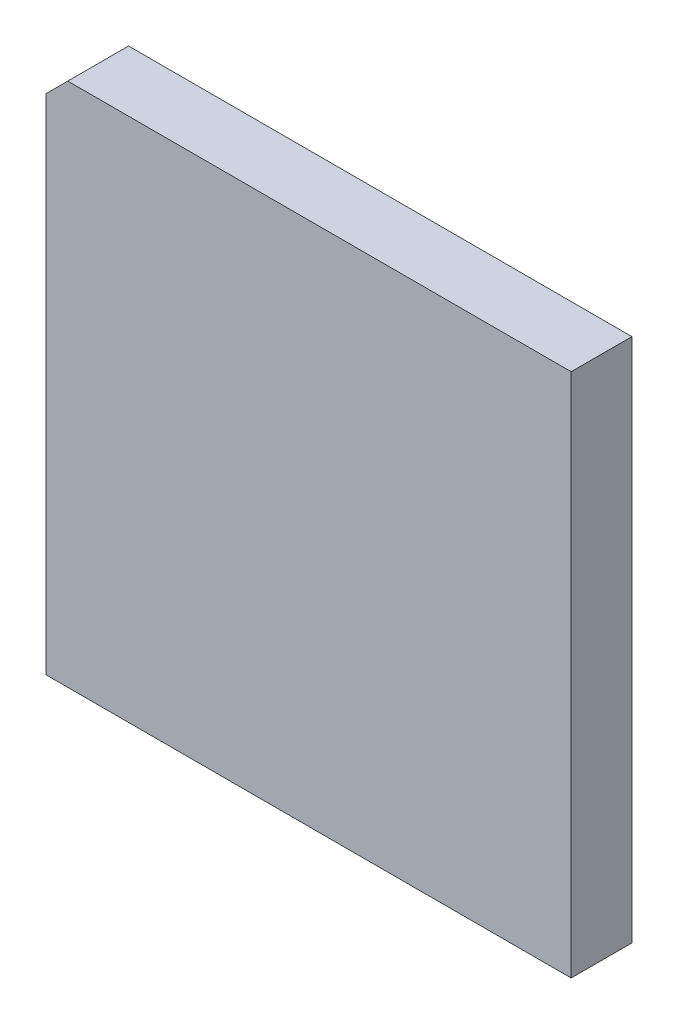
ISO-10303-21;
HEADER;
FILE_DESCRIPTION(('STEP AP214'),'2;1');
FILE_NAME('part.step','',(''),(''),'','','');
FILE_SCHEMA(('AUTOMOTIVE_DESIGN { 1 0 10303 214 1 1 1 1 }'));
ENDSEC;
DATA;
#1=APPLICATION_CONTEXT('core data for automotive mechanical design processes');
#2=APPLICATION_PROTOCOL_DEFINITION('international standard','automotive_design',2000,#1);
#3=PRODUCT_CONTEXT('',#1,'mechanical');
#4=PRODUCT('Part','Part','',(#3));
#5=PRODUCT_RELATED_PRODUCT_CATEGORY('part','',(#4));
#6=PRODUCT_DEFINITION_FORMATION('','',#4);
#7=PRODUCT_DEFINITION_CONTEXT('part definition',#1,'design');
#8=PRODUCT_DEFINITION('design','',#6,#7);
#9=PRODUCT_DEFINITION_SHAPE('','',#8);
#10=(LENGTH_UNIT() NAMED_UNIT(*) SI_UNIT(.MILLI.,.METRE.));
#11=(NAMED_UNIT(*) PLANE_ANGLE_UNIT() SI_UNIT($,.RADIAN.));
#12=(NAMED_UNIT(*) SI_UNIT($,.STERADIAN.) SOLID_ANGLE_UNIT());
#13=UNCERTAINTY_MEASURE_WITH_UNIT(LENGTH_MEASURE(1.E-05),#10,'distance_accuracy_value','');
#14=(GEOMETRIC_REPRESENTATION_CONTEXT(3) GLOBAL_UNCERTAINTY_ASSIGNED_CONTEXT((#13)) GLOBAL_UNIT_ASSIGNED_CONTEXT((#10,
#11,#12)) REPRESENTATION_CONTEXT('',''));
#15=CARTESIAN_POINT('',(0.,0.,0.));
#16=DIRECTION('',(0.,0.,1.));
#17=DIRECTION('',(1.,0.,0.));
#18=AXIS2_PLACEMENT_3D('',#15,#16,#17);
#19=CARTESIAN_POINT('',(6.05,6.05,1.4));
#20=DIRECTION('',(0.,-1.,0.));
#21=DIRECTION('',(0.,0.,-1.));
#22=AXIS2_PLACEMENT_3D('',#19,#20,#21);
#23=PLANE('',#22);
#24=DIRECTION('',(-1.,0.,0.));
#25=VECTOR('',#24,1.);
#26=CARTESIAN_POINT('',(6.05,6.05,0.));
#27=LINE('',#26,#25);
#28=CARTESIAN_POINT('',(6.05,6.05,0.));
#29=VERTEX_POINT('',#28);
#30=CARTESIAN_POINT('',(-5.55,6.05,0.));
#31=VERTEX_POINT('',#30);
#32=EDGE_CURVE('E108',#29,#31,#27,.T.);
#33=ORIENTED_EDGE('',*,*,#32,.T.);
#34=DIRECTION('',(0.,0.,-1.));
#35=VECTOR('',#34,1.);
#36=CARTESIAN_POINT('',(-5.55,6.05,1.4));
#37=LINE('',#36,#35);
#38=CARTESIAN_POINT('',(-5.55,6.05,1.4));
#39=VERTEX_POINT('',#38);
#40=EDGE_CURVE('E11',#39,#31,#37,.T.);
#41=ORIENTED_EDGE('',*,*,#40,.F.);
#42=DIRECTION('',(-1.,0.,0.));
#43=VECTOR('',#42,1.);
#44=CARTESIAN_POINT('',(6.05,6.05,1.4));
#45=LINE('',#44,#43);
#46=CARTESIAN_POINT('',(6.05,6.05,1.4));
#47=VERTEX_POINT('',#46);
#48=EDGE_CURVE('E116',#47,#39,#45,.T.);
#49=ORIENTED_EDGE('',*,*,#48,.F.);
#50=DIRECTION('',(0.,0.,-1.));
#51=VECTOR('',#50,1.);
#52=CARTESIAN_POINT('',(6.05,6.05,1.4));
#53=LINE('',#52,#51);
#54=EDGE_CURVE('E104',#47,#29,#53,.T.);
#55=ORIENTED_EDGE('',*,*,#54,.T.);
#56=EDGE_LOOP('',(#33,#41,#49,#55));
#57=FACE_BOUND('',#56,.T.);
#58=ADVANCED_FACE('F34',(#57),#23,.F.);
#59=CARTESIAN_POINT('',(-5.55,6.05,1.4));
#60=DIRECTION('',(0.707106781186548,-0.707106781186548,0.));
#61=DIRECTION('',(0.707106781186548,0.707106781186548,0.));
#62=AXIS2_PLACEMENT_3D('',#59,#60,#61);
#63=PLANE('',#62);
#64=DIRECTION('',(-0.707106781186548,-0.707106781186548,0.));
#65=VECTOR('',#64,1.);
#66=CARTESIAN_POINT('',(-5.55,6.05,0.));
#67=LINE('',#66,#65);
#68=CARTESIAN_POINT('',(-6.05,5.55,0.));
#69=VERTEX_POINT('',#68);
#70=EDGE_CURVE('E111',#31,#69,#67,.T.);
#71=ORIENTED_EDGE('',*,*,#70,.T.);
#72=DIRECTION('',(0.,0.,-1.));
#73=VECTOR('',#72,1.);
#74=CARTESIAN_POINT('',(-6.05,5.55,1.4));
#75=LINE('',#74,#73);
#76=CARTESIAN_POINT('',(-6.05,5.55,1.4));
#77=VERTEX_POINT('',#76);
#78=EDGE_CURVE('E42',#77,#69,#75,.T.);
#79=ORIENTED_EDGE('',*,*,#78,.F.);
#80=DIRECTION('',(-0.707106781186548,-0.707106781186548,0.));
#81=VECTOR('',#80,1.);
#82=CARTESIAN_POINT('',(-5.55,6.05,1.4));
#83=LINE('',#82,#81);
#84=EDGE_CURVE('E84',#39,#77,#83,.T.);
#85=ORIENTED_EDGE('',*,*,#84,.F.);
#86=ORIENTED_EDGE('',*,*,#40,.T.);
#87=EDGE_LOOP('',(#71,#79,#85,#86));
#88=FACE_BOUND('',#87,.T.);
#89=ADVANCED_FACE('F135',(#88),#63,.F.);
#90=CARTESIAN_POINT('',(-6.05,5.55,1.4));
#91=DIRECTION('',(1.,0.,0.));
#92=DIRECTION('',(0.,0.,-1.));
#93=AXIS2_PLACEMENT_3D('',#90,#91,#92);
#94=PLANE('',#93);
#95=DIRECTION('',(0.,-1.,0.));
#96=VECTOR('',#95,1.);
#97=CARTESIAN_POINT('',(-6.05,5.55,0.));
#98=LINE('',#97,#96);
#99=CARTESIAN_POINT('',(-6.05,-6.05,0.));
#100=VERTEX_POINT('',#99);
#101=EDGE_CURVE('E99',#69,#100,#98,.T.);
#102=ORIENTED_EDGE('',*,*,#101,.T.);
#103=DIRECTION('',(0.,0.,-1.));
#104=VECTOR('',#103,1.);
#105=CARTESIAN_POINT('',(-6.05,-6.05,1.4));
#106=LINE('',#105,#104);
#107=CARTESIAN_POINT('',(-6.05,-6.05,1.4));
#108=VERTEX_POINT('',#107);
#109=EDGE_CURVE('E96',#108,#100,#106,.T.);
#110=ORIENTED_EDGE('',*,*,#109,.F.);
#111=DIRECTION('',(0.,-1.,0.));
#112=VECTOR('',#111,1.);
#113=CARTESIAN_POINT('',(-6.05,5.55,1.4));
#114=LINE('',#113,#112);
#115=EDGE_CURVE('E88',#77,#108,#114,.T.);
#116=ORIENTED_EDGE('',*,*,#115,.F.);
#117=ORIENTED_EDGE('',*,*,#78,.T.);
#118=EDGE_LOOP('',(#102,#110,#116,#117));
#119=FACE_BOUND('',#118,.T.);
#120=ADVANCED_FACE('F97',(#119),#94,.F.);
#121=CARTESIAN_POINT('',(-6.05,-6.05,1.4));
#122=DIRECTION('',(0.,1.,0.));
#123=DIRECTION('',(0.,0.,1.));
#124=AXIS2_PLACEMENT_3D('',#121,#122,#123);
#125=PLANE('',#124);
#126=DIRECTION('',(1.,0.,0.));
#127=VECTOR('',#126,1.);
#128=CARTESIAN_POINT('',(-6.05,-6.05,0.));
#129=LINE('',#128,#127);
#130=CARTESIAN_POINT('',(6.05,-6.05,0.));
#131=VERTEX_POINT('',#130);
#132=EDGE_CURVE('E70',#100,#131,#129,.T.);
#133=ORIENTED_EDGE('',*,*,#132,.T.);
#134=DIRECTION('',(0.,0.,-1.));
#135=VECTOR('',#134,1.);
#136=CARTESIAN_POINT('',(6.05,-6.05,1.4));
#137=LINE('',#136,#135);
#138=CARTESIAN_POINT('',(6.05,-6.05,1.4));
#139=VERTEX_POINT('',#138);
#140=EDGE_CURVE('E100',#139,#131,#137,.T.);
#141=ORIENTED_EDGE('',*,*,#140,.F.);
#142=DIRECTION('',(1.,0.,0.));
#143=VECTOR('',#142,1.);
#144=CARTESIAN_POINT('',(-6.05,-6.05,1.4));
#145=LINE('',#144,#143);
#146=EDGE_CURVE('E92',#108,#139,#145,.T.);
#147=ORIENTED_EDGE('',*,*,#146,.F.);
#148=ORIENTED_EDGE('',*,*,#109,.T.);
#149=EDGE_LOOP('',(#133,#141,#147,#148));
#150=FACE_BOUND('',#149,.T.);
#151=ADVANCED_FACE('F102',(#150),#125,.F.);
#152=CARTESIAN_POINT('',(6.05,-6.05,1.4));
#153=DIRECTION('',(-1.,0.,0.));
#154=DIRECTION('',(0.,0.,1.));
#155=AXIS2_PLACEMENT_3D('',#152,#153,#154);
#156=PLANE('',#155);
#157=DIRECTION('',(0.,1.,0.));
#158=VECTOR('',#157,1.);
#159=CARTESIAN_POINT('',(6.05,-6.05,0.));
#160=LINE('',#159,#158);
#161=EDGE_CURVE('E76',#131,#29,#160,.T.);
#162=ORIENTED_EDGE('',*,*,#161,.T.);
#163=ORIENTED_EDGE('',*,*,#54,.F.);
#164=DIRECTION('',(0.,1.,0.));
#165=VECTOR('',#164,1.);
#166=CARTESIAN_POINT('',(6.05,-6.05,1.4));
#167=LINE('',#166,#165);
#168=EDGE_CURVE('E50',#139,#47,#167,.T.);
#169=ORIENTED_EDGE('',*,*,#168,.F.);
#170=ORIENTED_EDGE('',*,*,#140,.T.);
#171=EDGE_LOOP('',(#162,#163,#169,#170));
#172=FACE_BOUND('',#171,.T.);
#173=ADVANCED_FACE('F124',(#172),#156,.F.);
#174=CARTESIAN_POINT('',(0.,0.,1.4));
#175=DIRECTION('',(0.,0.,1.));
#176=DIRECTION('',(1.,0.,0.));
#177=AXIS2_PLACEMENT_3D('',#174,#175,#176);
#178=PLANE('',#177);
#179=ORIENTED_EDGE('',*,*,#48,.T.);
#180=ORIENTED_EDGE('',*,*,#84,.T.);
#181=ORIENTED_EDGE('',*,*,#115,.T.);
#182=ORIENTED_EDGE('',*,*,#146,.T.);
#183=ORIENTED_EDGE('',*,*,#168,.T.);
#184=EDGE_LOOP('',(#179,#180,#181,#182,#183));
#185=FACE_BOUND('',#184,.T.);
#186=ADVANCED_FACE('F90',(#185),#178,.T.);
#187=CARTESIAN_POINT('',(0.,0.,0.));
#188=DIRECTION('',(0.,0.,1.));
#189=DIRECTION('',(1.,0.,0.));
#190=AXIS2_PLACEMENT_3D('',#187,#188,#189);
#191=PLANE('',#190);
#192=ORIENTED_EDGE('',*,*,#32,.F.);
#193=ORIENTED_EDGE('',*,*,#161,.F.);
#194=ORIENTED_EDGE('',*,*,#132,.F.);
#195=ORIENTED_EDGE('',*,*,#101,.F.);
#196=ORIENTED_EDGE('',*,*,#70,.F.);
#197=EDGE_LOOP('',(#192,#193,#194,#195,#196));
#198=FACE_BOUND('',#197,.T.);
#199=ADVANCED_FACE('F120',(#198),#191,.F.);
#200=CLOSED_SHELL('',(#58,#89,#120,#151,#173,#186,#199));
#201=MANIFOLD_SOLID_BREP('B2',#200);
#202=ADVANCED_BREP_SHAPE_REPRESENTATION('',(#18,#201),#14);
#203=SHAPE_DEFINITION_REPRESENTATION(#9,#202);
ENDSEC;
END-ISO-10303-21;
